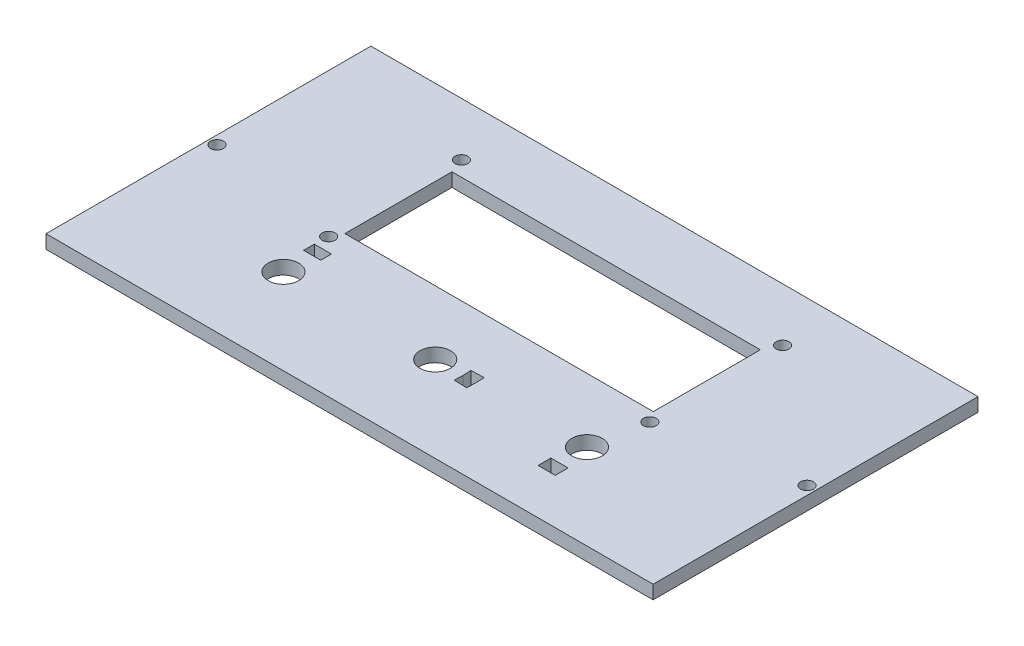
ISO-10303-21;
HEADER;
FILE_DESCRIPTION(('STEP AP214'),'2;1');
FILE_NAME('part.step','',(''),(''),'','','');
FILE_SCHEMA(('AUTOMOTIVE_DESIGN { 1 0 10303 214 1 1 1 1 }'));
ENDSEC;
DATA;
#1=APPLICATION_CONTEXT('core data for automotive mechanical design processes');
#2=APPLICATION_PROTOCOL_DEFINITION('international standard','automotive_design',2000,#1);
#3=PRODUCT_CONTEXT('',#1,'mechanical');
#4=PRODUCT('Part','Part','',(#3));
#5=PRODUCT_RELATED_PRODUCT_CATEGORY('part','',(#4));
#6=PRODUCT_DEFINITION_FORMATION('','',#4);
#7=PRODUCT_DEFINITION_CONTEXT('part definition',#1,'design');
#8=PRODUCT_DEFINITION('design','',#6,#7);
#9=PRODUCT_DEFINITION_SHAPE('','',#8);
#10=(LENGTH_UNIT() NAMED_UNIT(*) SI_UNIT(.MILLI.,.METRE.));
#11=(NAMED_UNIT(*) PLANE_ANGLE_UNIT() SI_UNIT($,.RADIAN.));
#12=(NAMED_UNIT(*) SI_UNIT($,.STERADIAN.) SOLID_ANGLE_UNIT());
#13=UNCERTAINTY_MEASURE_WITH_UNIT(LENGTH_MEASURE(1.E-05),#10,'distance_accuracy_value','');
#14=(GEOMETRIC_REPRESENTATION_CONTEXT(3) GLOBAL_UNCERTAINTY_ASSIGNED_CONTEXT((#13)) GLOBAL_UNIT_ASSIGNED_CONTEXT((#10,
#11,#12)) REPRESENTATION_CONTEXT('',''));
#15=CARTESIAN_POINT('',(0.,0.,0.));
#16=DIRECTION('',(0.,0.,1.));
#17=DIRECTION('',(1.,0.,0.));
#18=AXIS2_PLACEMENT_3D('',#15,#16,#17);
#19=CARTESIAN_POINT('',(0.,3.175,0.));
#20=DIRECTION('',(0.,1.,0.));
#21=DIRECTION('',(0.,0.,1.));
#22=AXIS2_PLACEMENT_3D('',#19,#20,#21);
#23=PLANE('',#22);
#24=CARTESIAN_POINT('',(68.8808195,3.175,0.));
#25=DIRECTION('',(0.,1.,0.));
#26=DIRECTION('',(0.,0.,1.));
#27=AXIS2_PLACEMENT_3D('',#24,#25,#26);
#28=CIRCLE('',#27,1.5);
#29=CARTESIAN_POINT('',(68.8808195,3.175,1.5));
#30=VERTEX_POINT('',#29);
#31=EDGE_CURVE('E347',#30,#30,#28,.T.);
#32=ORIENTED_EDGE('',*,*,#31,.F.);
#33=EDGE_LOOP('',(#32));
#34=FACE_BOUND('',#33,.T.);
#35=CARTESIAN_POINT('',(-68.8808195,3.175,0.));
#36=DIRECTION('',(0.,1.,0.));
#37=DIRECTION('',(0.,0.,1.));
#38=AXIS2_PLACEMENT_3D('',#35,#36,#37);
#39=CIRCLE('',#38,1.5);
#40=CARTESIAN_POINT('',(-68.8808195,3.175,1.50000000000001));
#41=VERTEX_POINT('',#40);
#42=EDGE_CURVE('E346',#41,#41,#39,.T.);
#43=ORIENTED_EDGE('',*,*,#42,.F.);
#44=EDGE_LOOP('',(#43));
#45=FACE_BOUND('',#44,.T.);
#46=CARTESIAN_POINT('',(-37.3,3.175,-25.4850000000002));
#47=DIRECTION('',(0.,1.,0.));
#48=DIRECTION('',(0.,0.,1.));
#49=AXIS2_PLACEMENT_3D('',#46,#47,#48);
#50=CIRCLE('',#49,1.5);
#51=CARTESIAN_POINT('',(-37.3,3.175,-23.9850000000002));
#52=VERTEX_POINT('',#51);
#53=EDGE_CURVE('E364',#52,#52,#50,.T.);
#54=ORIENTED_EDGE('',*,*,#53,.F.);
#55=EDGE_LOOP('',(#54));
#56=FACE_BOUND('',#55,.T.);
#57=CARTESIAN_POINT('',(-37.3,3.175,5.51499999999984));
#58=DIRECTION('',(0.,1.,0.));
#59=DIRECTION('',(0.,0.,1.));
#60=AXIS2_PLACEMENT_3D('',#57,#58,#59);
#61=CIRCLE('',#60,1.5);
#62=CARTESIAN_POINT('',(-37.3,3.175,7.01499999999985));
#63=VERTEX_POINT('',#62);
#64=EDGE_CURVE('E360',#63,#63,#61,.T.);
#65=ORIENTED_EDGE('',*,*,#64,.F.);
#66=EDGE_LOOP('',(#65));
#67=FACE_BOUND('',#66,.T.);
#68=CARTESIAN_POINT('',(37.7,3.175,5.51499999999984));
#69=DIRECTION('',(0.,1.,0.));
#70=DIRECTION('',(0.,0.,1.));
#71=AXIS2_PLACEMENT_3D('',#68,#69,#70);
#72=CIRCLE('',#71,1.5);
#73=CARTESIAN_POINT('',(37.7,3.175,7.01499999999985));
#74=VERTEX_POINT('',#73);
#75=EDGE_CURVE('E355',#74,#74,#72,.T.);
#76=ORIENTED_EDGE('',*,*,#75,.F.);
#77=EDGE_LOOP('',(#76));
#78=FACE_BOUND('',#77,.T.);
#79=CARTESIAN_POINT('',(37.7,3.175,-25.4850000000002));
#80=DIRECTION('',(0.,1.,0.));
#81=DIRECTION('',(0.,0.,1.));
#82=AXIS2_PLACEMENT_3D('',#79,#80,#81);
#83=CIRCLE('',#82,1.5);
#84=CARTESIAN_POINT('',(37.7,3.175,-23.9850000000002));
#85=VERTEX_POINT('',#84);
#86=EDGE_CURVE('E359',#85,#85,#83,.T.);
#87=ORIENTED_EDGE('',*,*,#86,.F.);
#88=EDGE_LOOP('',(#87));
#89=FACE_BOUND('',#88,.T.);
#90=DIRECTION('',(-1.,0.,0.));
#91=VECTOR('',#90,1.);
#92=CARTESIAN_POINT('',(36.,3.175,-21.985));
#93=LINE('',#92,#91);
#94=CARTESIAN_POINT('',(36.,3.175,-21.985));
#95=VERTEX_POINT('',#94);
#96=CARTESIAN_POINT('',(-36.,3.175,-21.985));
#97=VERTEX_POINT('',#96);
#98=EDGE_CURVE('E372',#95,#97,#93,.T.);
#99=ORIENTED_EDGE('',*,*,#98,.F.);
#100=DIRECTION('',(0.,0.,-1.));
#101=VECTOR('',#100,1.);
#102=CARTESIAN_POINT('',(36.,3.175,-21.985));
#103=LINE('',#102,#101);
#104=CARTESIAN_POINT('',(36.,3.175,3.01499999999998));
#105=VERTEX_POINT('',#104);
#106=EDGE_CURVE('E384',#105,#95,#103,.T.);
#107=ORIENTED_EDGE('',*,*,#106,.F.);
#108=DIRECTION('',(1.,0.,0.));
#109=VECTOR('',#108,1.);
#110=CARTESIAN_POINT('',(-36.,3.175,3.015));
#111=LINE('',#110,#109);
#112=CARTESIAN_POINT('',(-36.,3.175,3.015));
#113=VERTEX_POINT('',#112);
#114=EDGE_CURVE('E380',#113,#105,#111,.T.);
#115=ORIENTED_EDGE('',*,*,#114,.F.);
#116=DIRECTION('',(0.,0.,1.));
#117=VECTOR('',#116,1.);
#118=CARTESIAN_POINT('',(-36.,3.175,-21.985));
#119=LINE('',#118,#117);
#120=EDGE_CURVE('E375',#97,#113,#119,.T.);
#121=ORIENTED_EDGE('',*,*,#120,.F.);
#122=EDGE_LOOP('',(#99,#107,#115,#121));
#123=FACE_BOUND('',#122,.T.);
#124=CARTESIAN_POINT('',(-35.4408195,3.175,17.92920774285));
#125=DIRECTION('',(0.,1.,0.));
#126=DIRECTION('',(0.,0.,1.));
#127=AXIS2_PLACEMENT_3D('',#124,#125,#126);
#128=CIRCLE('',#127,3.5625);
#129=CARTESIAN_POINT('',(-35.4408195,3.175,21.49170774285));
#130=VERTEX_POINT('',#129);
#131=EDGE_CURVE('E402',#130,#130,#128,.T.);
#132=ORIENTED_EDGE('',*,*,#131,.F.);
#133=EDGE_LOOP('',(#132));
#134=FACE_BOUND('',#133,.T.);
#135=CARTESIAN_POINT('',(0.,3.175,17.92920774285));
#136=DIRECTION('',(0.,1.,0.));
#137=DIRECTION('',(0.,0.,1.));
#138=AXIS2_PLACEMENT_3D('',#135,#136,#137);
#139=CIRCLE('',#138,3.5625);
#140=CARTESIAN_POINT('',(0.,3.175,21.49170774285));
#141=VERTEX_POINT('',#140);
#142=EDGE_CURVE('E407',#141,#141,#139,.T.);
#143=ORIENTED_EDGE('',*,*,#142,.F.);
#144=EDGE_LOOP('',(#143));
#145=FACE_BOUND('',#144,.T.);
#146=CARTESIAN_POINT('',(35.4408195,3.175,17.92920774285));
#147=DIRECTION('',(0.,1.,0.));
#148=DIRECTION('',(0.,0.,1.));
#149=AXIS2_PLACEMENT_3D('',#146,#147,#148);
#150=CIRCLE('',#149,3.5625);
#151=CARTESIAN_POINT('',(35.4408195,3.175,21.49170774285));
#152=VERTEX_POINT('',#151);
#153=EDGE_CURVE('E392',#152,#152,#150,.T.);
#154=ORIENTED_EDGE('',*,*,#153,.F.);
#155=EDGE_LOOP('',(#154));
#156=FACE_BOUND('',#155,.T.);
#157=DIRECTION('',(0.,0.,-1.));
#158=VECTOR('',#157,1.);
#159=CARTESIAN_POINT('',(70.8808195,3.175,-37.92920774285));
#160=LINE('',#159,#158);
#161=CARTESIAN_POINT('',(70.8808195,3.175,37.92920774285));
#162=VERTEX_POINT('',#161);
#163=CARTESIAN_POINT('',(70.8808195,3.175,-37.92920774285));
#164=VERTEX_POINT('',#163);
#165=EDGE_CURVE('E414',#162,#164,#160,.T.);
#166=ORIENTED_EDGE('',*,*,#165,.T.);
#167=DIRECTION('',(-1.,0.,0.));
#168=VECTOR('',#167,1.);
#169=CARTESIAN_POINT('',(-70.8808195,3.175,-37.92920774285));
#170=LINE('',#169,#168);
#171=CARTESIAN_POINT('',(-70.8808195,3.175,-37.92920774285));
#172=VERTEX_POINT('',#171);
#173=EDGE_CURVE('E418',#164,#172,#170,.T.);
#174=ORIENTED_EDGE('',*,*,#173,.T.);
#175=DIRECTION('',(0.,0.,1.));
#176=VECTOR('',#175,1.);
#177=CARTESIAN_POINT('',(-70.8808195,3.175,-37.92920774285));
#178=LINE('',#177,#176);
#179=CARTESIAN_POINT('',(-70.8808195,3.175,37.92920774285));
#180=VERTEX_POINT('',#179);
#181=EDGE_CURVE('E422',#172,#180,#178,.T.);
#182=ORIENTED_EDGE('',*,*,#181,.T.);
#183=DIRECTION('',(1.,0.,0.));
#184=VECTOR('',#183,1.);
#185=CARTESIAN_POINT('',(-70.8808195,3.175,37.92920774285));
#186=LINE('',#185,#184);
#187=EDGE_CURVE('E425',#180,#162,#186,.T.);
#188=ORIENTED_EDGE('',*,*,#187,.T.);
#189=EDGE_LOOP('',(#166,#174,#182,#188));
#190=FACE_BOUND('',#189,.T.);
#191=DIRECTION('',(0.,0.,1.));
#192=VECTOR('',#191,1.);
#193=CARTESIAN_POINT('',(-33.4408195,3.175,0.));
#194=LINE('',#193,#192);
#195=CARTESIAN_POINT('',(-33.4408195,3.175,8.72541481264997));
#196=VERTEX_POINT('',#195);
#197=CARTESIAN_POINT('',(-33.4408195,3.175,11.22541481265));
#198=VERTEX_POINT('',#197);
#199=EDGE_CURVE('E304',#196,#198,#194,.T.);
#200=ORIENTED_EDGE('',*,*,#199,.T.);
#201=DIRECTION('',(-1.,0.,0.));
#202=VECTOR('',#201,1.);
#203=CARTESIAN_POINT('',(0.,3.175,11.22541481265));
#204=LINE('',#203,#202);
#205=CARTESIAN_POINT('',(-37.4408195,3.175,11.22541481265));
#206=VERTEX_POINT('',#205);
#207=EDGE_CURVE('E308',#198,#206,#204,.T.);
#208=ORIENTED_EDGE('',*,*,#207,.T.);
#209=DIRECTION('',(0.,0.,1.));
#210=VECTOR('',#209,1.);
#211=CARTESIAN_POINT('',(-37.4408195,3.175,0.));
#212=LINE('',#211,#210);
#213=CARTESIAN_POINT('',(-37.4408195,3.175,8.72541481264997));
#214=VERTEX_POINT('',#213);
#215=EDGE_CURVE('E223',#214,#206,#212,.T.);
#216=ORIENTED_EDGE('',*,*,#215,.F.);
#217=DIRECTION('',(1.,0.,0.));
#218=VECTOR('',#217,1.);
#219=CARTESIAN_POINT('',(0.,3.175,8.72541481264997));
#220=LINE('',#219,#218);
#221=EDGE_CURVE('E300',#214,#196,#220,.T.);
#222=ORIENTED_EDGE('',*,*,#221,.T.);
#223=EDGE_LOOP('',(#200,#208,#216,#222));
#224=FACE_BOUND('',#223,.T.);
#225=DIRECTION('',(-0.0266639306913008,0.,0.999644454193635));
#226=VECTOR('',#225,1.);
#227=CARTESIAN_POINT('',(6.92656455818514,3.175,0.1847551262186));
#228=LINE('',#227,#226);
#229=CARTESIAN_POINT('',(6.45325942180383,3.175,17.9292077428501));
#230=VERTEX_POINT('',#229);
#231=CARTESIAN_POINT('',(6.4009794202858,3.175,19.8892118468131));
#232=VERTEX_POINT('',#231);
#233=EDGE_CURVE('E326',#230,#232,#228,.T.);
#234=ORIENTED_EDGE('',*,*,#233,.F.);
#235=DIRECTION('',(-0.0266639306913067,0.,-0.999644454193634));
#236=VECTOR('',#235,1.);
#237=CARTESIAN_POINT('',(5.97077819967263,3.175,-0.159261040684369));
#238=LINE('',#237,#236);
#239=CARTESIAN_POINT('',(6.40097942028579,3.175,15.969203638887));
#240=VERTEX_POINT('',#239);
#241=EDGE_CURVE('E329',#230,#240,#238,.T.);
#242=ORIENTED_EDGE('',*,*,#241,.T.);
#243=DIRECTION('',(-0.999644454193634,0.,0.0266639306913096));
#244=VECTOR('',#243,1.);
#245=CARTESIAN_POINT('',(0.430201220613209,3.175,16.1284646795714));
#246=LINE('',#245,#244);
#247=CARTESIAN_POINT('',(9.39991278286669,3.175,15.8892118468131));
#248=VERTEX_POINT('',#247);
#249=EDGE_CURVE('E312',#248,#240,#246,.T.);
#250=ORIENTED_EDGE('',*,*,#249,.F.);
#251=DIRECTION('',(-0.0266639306913091,0.,-0.999644454193634));
#252=VECTOR('',#251,1.);
#253=CARTESIAN_POINT('',(8.96971156225349,3.175,-0.239252832758309));
#254=LINE('',#253,#252);
#255=CARTESIAN_POINT('',(9.45432643859628,3.175,17.92920774285));
#256=VERTEX_POINT('',#255);
#257=EDGE_CURVE('E315',#256,#248,#254,.T.);
#258=ORIENTED_EDGE('',*,*,#257,.F.);
#259=DIRECTION('',(-0.0266639306913024,0.,0.999644454193635));
#260=VECTOR('',#259,1.);
#261=CARTESIAN_POINT('',(9.92549792076607,3.175,0.26474691829252));
#262=LINE('',#261,#260);
#263=CARTESIAN_POINT('',(9.3999127828667,3.175,19.969203638887));
#264=VERTEX_POINT('',#263);
#265=EDGE_CURVE('E318',#256,#264,#262,.T.);
#266=ORIENTED_EDGE('',*,*,#265,.T.);
#267=DIRECTION('',(-0.999644454193635,0.,-0.0266639306913027));
#268=VECTOR('',#267,1.);
#269=CARTESIAN_POINT('',(-0.525585137899372,3.175,19.7044567205945));
#270=LINE('',#269,#268);
#271=EDGE_CURVE('E322',#264,#232,#270,.T.);
#272=ORIENTED_EDGE('',*,*,#271,.T.);
#273=EDGE_LOOP('',(#234,#242,#250,#258,#266,#272));
#274=FACE_BOUND('',#273,.T.);
#275=DIRECTION('',(1.,0.,0.));
#276=VECTOR('',#275,1.);
#277=CARTESIAN_POINT('',(0.,3.175,24.3496589051601));
#278=LINE('',#277,#276);
#279=CARTESIAN_POINT('',(33.4408195,3.175,24.3496589051601));
#280=VERTEX_POINT('',#279);
#281=CARTESIAN_POINT('',(37.4408195,3.175,24.3496589051601));
#282=VERTEX_POINT('',#281);
#283=EDGE_CURVE('E338',#280,#282,#278,.T.);
#284=ORIENTED_EDGE('',*,*,#283,.T.);
#285=DIRECTION('',(0.,0.,1.));
#286=VECTOR('',#285,1.);
#287=CARTESIAN_POINT('',(37.4408194999999,3.175,0.));
#288=LINE('',#287,#286);
#289=CARTESIAN_POINT('',(37.4408195,3.175,27.3496589051602));
#290=VERTEX_POINT('',#289);
#291=EDGE_CURVE('E342',#282,#290,#288,.T.);
#292=ORIENTED_EDGE('',*,*,#291,.T.);
#293=DIRECTION('',(1.,0.,0.));
#294=VECTOR('',#293,1.);
#295=CARTESIAN_POINT('',(0.,3.175,27.3496589051602));
#296=LINE('',#295,#294);
#297=CARTESIAN_POINT('',(33.4408195,3.175,27.3496589051602));
#298=VERTEX_POINT('',#297);
#299=EDGE_CURVE('E333',#298,#290,#296,.T.);
#300=ORIENTED_EDGE('',*,*,#299,.F.);
#301=DIRECTION('',(0.,0.,1.));
#302=VECTOR('',#301,1.);
#303=CARTESIAN_POINT('',(33.4408195000001,3.175,0.));
#304=LINE('',#303,#302);
#305=EDGE_CURVE('E195',#280,#298,#304,.T.);
#306=ORIENTED_EDGE('',*,*,#305,.F.);
#307=EDGE_LOOP('',(#284,#292,#300,#306));
#308=FACE_BOUND('',#307,.T.);
#309=ADVANCED_FACE('F38',(#34,#45,#56,#67,#78,#89,#123,#134,#145,#156,#190,#224,#274,#308),#23,.T.);
#310=CARTESIAN_POINT('',(0.,0.,0.));
#311=DIRECTION('',(0.,1.,0.));
#312=DIRECTION('',(0.,0.,1.));
#313=AXIS2_PLACEMENT_3D('',#310,#311,#312);
#314=PLANE('',#313);
#315=DIRECTION('',(0.0266639306913067,0.,0.999644454193635));
#316=VECTOR('',#315,1.);
#317=CARTESIAN_POINT('',(5.97077819967263,0.,-0.159261040684369));
#318=LINE('',#317,#316);
#319=CARTESIAN_POINT('',(6.40097942028579,0.,15.969203638887));
#320=VERTEX_POINT('',#319);
#321=CARTESIAN_POINT('',(6.45325942180383,0.,17.9292077428501));
#322=VERTEX_POINT('',#321);
#323=EDGE_CURVE('E228',#320,#322,#318,.T.);
#324=ORIENTED_EDGE('',*,*,#323,.T.);
#325=DIRECTION('',(0.0266639306913008,0.,-0.999644454193635));
#326=VECTOR('',#325,1.);
#327=CARTESIAN_POINT('',(6.92656455818513,0.,0.1847551262186));
#328=LINE('',#327,#326);
#329=CARTESIAN_POINT('',(6.4009794202858,0.,19.8892118468131));
#330=VERTEX_POINT('',#329);
#331=EDGE_CURVE('E248',#330,#322,#328,.T.);
#332=ORIENTED_EDGE('',*,*,#331,.F.);
#333=DIRECTION('',(0.999644454193635,0.,0.0266639306913027));
#334=VECTOR('',#333,1.);
#335=CARTESIAN_POINT('',(-0.525585137899372,0.,19.7044567205945));
#336=LINE('',#335,#334);
#337=CARTESIAN_POINT('',(9.3999127828667,0.,19.969203638887));
#338=VERTEX_POINT('',#337);
#339=EDGE_CURVE('E244',#330,#338,#336,.T.);
#340=ORIENTED_EDGE('',*,*,#339,.T.);
#341=DIRECTION('',(0.0266639306913024,0.,-0.999644454193635));
#342=VECTOR('',#341,1.);
#343=CARTESIAN_POINT('',(9.92549792076607,0.,0.26474691829252));
#344=LINE('',#343,#342);
#345=CARTESIAN_POINT('',(9.45432643859628,0.,17.92920774285));
#346=VERTEX_POINT('',#345);
#347=EDGE_CURVE('E240',#338,#346,#344,.T.);
#348=ORIENTED_EDGE('',*,*,#347,.T.);
#349=DIRECTION('',(0.0266639306913091,0.,0.999644454193634));
#350=VECTOR('',#349,1.);
#351=CARTESIAN_POINT('',(8.96971156225349,0.,-0.239252832758309));
#352=LINE('',#351,#350);
#353=CARTESIAN_POINT('',(9.39991278286669,0.,15.8892118468131));
#354=VERTEX_POINT('',#353);
#355=EDGE_CURVE('E236',#354,#346,#352,.T.);
#356=ORIENTED_EDGE('',*,*,#355,.F.);
#357=DIRECTION('',(0.999644454193634,0.,-0.0266639306913096));
#358=VECTOR('',#357,1.);
#359=CARTESIAN_POINT('',(0.430201220613209,0.,16.1284646795714));
#360=LINE('',#359,#358);
#361=EDGE_CURVE('E232',#320,#354,#360,.T.);
#362=ORIENTED_EDGE('',*,*,#361,.F.);
#363=EDGE_LOOP('',(#324,#332,#340,#348,#356,#362));
#364=FACE_BOUND('',#363,.T.);
#365=DIRECTION('',(0.,0.,-1.));
#366=VECTOR('',#365,1.);
#367=CARTESIAN_POINT('',(70.8808195,0.,-37.92920774285));
#368=LINE('',#367,#366);
#369=CARTESIAN_POINT('',(70.8808195,0.,37.92920774285));
#370=VERTEX_POINT('',#369);
#371=CARTESIAN_POINT('',(70.8808195,0.,-37.92920774285));
#372=VERTEX_POINT('',#371);
#373=EDGE_CURVE('E429',#370,#372,#368,.T.);
#374=ORIENTED_EDGE('',*,*,#373,.F.);
#375=DIRECTION('',(1.,0.,0.));
#376=VECTOR('',#375,1.);
#377=CARTESIAN_POINT('',(-70.8808195,0.,37.92920774285));
#378=LINE('',#377,#376);
#379=CARTESIAN_POINT('',(-70.8808195,0.,37.92920774285));
#380=VERTEX_POINT('',#379);
#381=EDGE_CURVE('E419',#380,#370,#378,.T.);
#382=ORIENTED_EDGE('',*,*,#381,.F.);
#383=DIRECTION('',(0.,0.,1.));
#384=VECTOR('',#383,1.);
#385=CARTESIAN_POINT('',(-70.8808195,0.,-37.92920774285));
#386=LINE('',#385,#384);
#387=CARTESIAN_POINT('',(-70.8808195,0.,-37.92920774285));
#388=VERTEX_POINT('',#387);
#389=EDGE_CURVE('E437',#388,#380,#386,.T.);
#390=ORIENTED_EDGE('',*,*,#389,.F.);
#391=DIRECTION('',(-1.,0.,0.));
#392=VECTOR('',#391,1.);
#393=CARTESIAN_POINT('',(-70.8808195,0.,-37.92920774285));
#394=LINE('',#393,#392);
#395=EDGE_CURVE('E433',#372,#388,#394,.T.);
#396=ORIENTED_EDGE('',*,*,#395,.F.);
#397=EDGE_LOOP('',(#374,#382,#390,#396));
#398=FACE_BOUND('',#397,.T.);
#399=CARTESIAN_POINT('',(35.4408195,0.,17.92920774285));
#400=DIRECTION('',(0.,1.,0.));
#401=DIRECTION('',(0.,0.,1.));
#402=AXIS2_PLACEMENT_3D('',#399,#400,#401);
#403=CIRCLE('',#402,3.5625);
#404=CARTESIAN_POINT('',(35.4408195,0.,21.49170774285));
#405=VERTEX_POINT('',#404);
#406=EDGE_CURVE('E406',#405,#405,#403,.T.);
#407=ORIENTED_EDGE('',*,*,#406,.T.);
#408=EDGE_LOOP('',(#407));
#409=FACE_BOUND('',#408,.T.);
#410=CARTESIAN_POINT('',(0.,0.,17.92920774285));
#411=DIRECTION('',(0.,1.,0.));
#412=DIRECTION('',(0.,0.,1.));
#413=AXIS2_PLACEMENT_3D('',#410,#411,#412);
#414=CIRCLE('',#413,3.5625);
#415=CARTESIAN_POINT('',(0.,0.,21.49170774285));
#416=VERTEX_POINT('',#415);
#417=EDGE_CURVE('E461',#416,#416,#414,.T.);
#418=ORIENTED_EDGE('',*,*,#417,.T.);
#419=EDGE_LOOP('',(#418));
#420=FACE_BOUND('',#419,.T.);
#421=CARTESIAN_POINT('',(-35.4408195,0.,17.92920774285));
#422=DIRECTION('',(0.,1.,0.));
#423=DIRECTION('',(0.,0.,1.));
#424=AXIS2_PLACEMENT_3D('',#421,#422,#423);
#425=CIRCLE('',#424,3.5625);
#426=CARTESIAN_POINT('',(-35.4408195,0.,21.49170774285));
#427=VERTEX_POINT('',#426);
#428=EDGE_CURVE('E434',#427,#427,#425,.T.);
#429=ORIENTED_EDGE('',*,*,#428,.T.);
#430=EDGE_LOOP('',(#429));
#431=FACE_BOUND('',#430,.T.);
#432=DIRECTION('',(0.,0.,-1.));
#433=VECTOR('',#432,1.);
#434=CARTESIAN_POINT('',(36.,0.,0.));
#435=LINE('',#434,#433);
#436=CARTESIAN_POINT('',(36.,0.,3.01499999999998));
#437=VERTEX_POINT('',#436);
#438=CARTESIAN_POINT('',(36.,0.,-21.985));
#439=VERTEX_POINT('',#438);
#440=EDGE_CURVE('E48',#437,#439,#435,.T.);
#441=ORIENTED_EDGE('',*,*,#440,.T.);
#442=DIRECTION('',(-1.,0.,0.));
#443=VECTOR('',#442,1.);
#444=CARTESIAN_POINT('',(0.,0.,-21.985));
#445=LINE('',#444,#443);
#446=CARTESIAN_POINT('',(-36.,0.,-21.985));
#447=VERTEX_POINT('',#446);
#448=EDGE_CURVE('E11',#439,#447,#445,.T.);
#449=ORIENTED_EDGE('',*,*,#448,.T.);
#450=DIRECTION('',(0.,0.,1.));
#451=VECTOR('',#450,1.);
#452=CARTESIAN_POINT('',(-36.,0.,0.));
#453=LINE('',#452,#451);
#454=CARTESIAN_POINT('',(-36.,0.,3.015));
#455=VERTEX_POINT('',#454);
#456=EDGE_CURVE('E457',#447,#455,#453,.T.);
#457=ORIENTED_EDGE('',*,*,#456,.T.);
#458=DIRECTION('',(1.,0.,0.));
#459=VECTOR('',#458,1.);
#460=CARTESIAN_POINT('',(0.,0.,3.01499999999999));
#461=LINE('',#460,#459);
#462=EDGE_CURVE('E471',#455,#437,#461,.T.);
#463=ORIENTED_EDGE('',*,*,#462,.T.);
#464=EDGE_LOOP('',(#441,#449,#457,#463));
#465=FACE_BOUND('',#464,.T.);
#466=CARTESIAN_POINT('',(37.7,0.,-25.4850000000002));
#467=DIRECTION('',(0.,1.,0.));
#468=DIRECTION('',(0.,0.,1.));
#469=AXIS2_PLACEMENT_3D('',#466,#467,#468);
#470=CIRCLE('',#469,1.5);
#471=CARTESIAN_POINT('',(37.7,0.,-23.9850000000002));
#472=VERTEX_POINT('',#471);
#473=EDGE_CURVE('E371',#472,#472,#470,.T.);
#474=ORIENTED_EDGE('',*,*,#473,.T.);
#475=EDGE_LOOP('',(#474));
#476=FACE_BOUND('',#475,.T.);
#477=CARTESIAN_POINT('',(37.7,0.,5.51499999999984));
#478=DIRECTION('',(0.,1.,0.));
#479=DIRECTION('',(0.,0.,1.));
#480=AXIS2_PLACEMENT_3D('',#477,#478,#479);
#481=CIRCLE('',#480,1.5);
#482=CARTESIAN_POINT('',(37.7,0.,7.01499999999985));
#483=VERTEX_POINT('',#482);
#484=EDGE_CURVE('E481',#483,#483,#481,.T.);
#485=ORIENTED_EDGE('',*,*,#484,.T.);
#486=EDGE_LOOP('',(#485));
#487=FACE_BOUND('',#486,.T.);
#488=CARTESIAN_POINT('',(-37.3,0.,5.51499999999984));
#489=DIRECTION('',(0.,1.,0.));
#490=DIRECTION('',(0.,0.,1.));
#491=AXIS2_PLACEMENT_3D('',#488,#489,#490);
#492=CIRCLE('',#491,1.5);
#493=CARTESIAN_POINT('',(-37.3,0.,7.01499999999985));
#494=VERTEX_POINT('',#493);
#495=EDGE_CURVE('E485',#494,#494,#492,.T.);
#496=ORIENTED_EDGE('',*,*,#495,.T.);
#497=EDGE_LOOP('',(#496));
#498=FACE_BOUND('',#497,.T.);
#499=CARTESIAN_POINT('',(-37.3,0.,-25.4850000000002));
#500=DIRECTION('',(0.,1.,0.));
#501=DIRECTION('',(0.,0.,1.));
#502=AXIS2_PLACEMENT_3D('',#499,#500,#501);
#503=CIRCLE('',#502,1.5);
#504=CARTESIAN_POINT('',(-37.3,0.,-23.9850000000002));
#505=VERTEX_POINT('',#504);
#506=EDGE_CURVE('E376',#505,#505,#503,.T.);
#507=ORIENTED_EDGE('',*,*,#506,.T.);
#508=EDGE_LOOP('',(#507));
#509=FACE_BOUND('',#508,.T.);
#510=CARTESIAN_POINT('',(-68.8808195,0.,0.));
#511=DIRECTION('',(0.,1.,0.));
#512=DIRECTION('',(0.,0.,1.));
#513=AXIS2_PLACEMENT_3D('',#510,#511,#512);
#514=CIRCLE('',#513,1.5);
#515=CARTESIAN_POINT('',(-68.8808195,0.,1.50000000000001));
#516=VERTEX_POINT('',#515);
#517=EDGE_CURVE('E351',#516,#516,#514,.T.);
#518=ORIENTED_EDGE('',*,*,#517,.T.);
#519=EDGE_LOOP('',(#518));
#520=FACE_BOUND('',#519,.T.);
#521=CARTESIAN_POINT('',(68.8808195,0.,0.));
#522=DIRECTION('',(0.,1.,0.));
#523=DIRECTION('',(0.,0.,1.));
#524=AXIS2_PLACEMENT_3D('',#521,#522,#523);
#525=CIRCLE('',#524,1.5);
#526=CARTESIAN_POINT('',(68.8808195,0.,1.5));
#527=VERTEX_POINT('',#526);
#528=EDGE_CURVE('E42',#527,#527,#525,.T.);
#529=ORIENTED_EDGE('',*,*,#528,.T.);
#530=EDGE_LOOP('',(#529));
#531=FACE_BOUND('',#530,.T.);
#532=DIRECTION('',(1.,0.,0.));
#533=VECTOR('',#532,1.);
#534=CARTESIAN_POINT('',(0.,0.,11.22541481265));
#535=LINE('',#534,#533);
#536=CARTESIAN_POINT('',(-37.4408195,0.,11.22541481265));
#537=VERTEX_POINT('',#536);
#538=CARTESIAN_POINT('',(-33.4408195,0.,11.22541481265));
#539=VERTEX_POINT('',#538);
#540=EDGE_CURVE('E270',#537,#539,#535,.T.);
#541=ORIENTED_EDGE('',*,*,#540,.T.);
#542=DIRECTION('',(0.,0.,-1.));
#543=VECTOR('',#542,1.);
#544=CARTESIAN_POINT('',(-33.4408195,0.,0.));
#545=LINE('',#544,#543);
#546=CARTESIAN_POINT('',(-33.4408195,0.,8.72541481264997));
#547=VERTEX_POINT('',#546);
#548=EDGE_CURVE('E282',#539,#547,#545,.T.);
#549=ORIENTED_EDGE('',*,*,#548,.T.);
#550=DIRECTION('',(-1.,0.,0.));
#551=VECTOR('',#550,1.);
#552=CARTESIAN_POINT('',(0.,0.,8.72541481264997));
#553=LINE('',#552,#551);
#554=CARTESIAN_POINT('',(-37.4408195,0.,8.72541481264997));
#555=VERTEX_POINT('',#554);
#556=EDGE_CURVE('E278',#547,#555,#553,.T.);
#557=ORIENTED_EDGE('',*,*,#556,.T.);
#558=DIRECTION('',(0.,0.,-1.));
#559=VECTOR('',#558,1.);
#560=CARTESIAN_POINT('',(-37.4408195,0.,0.));
#561=LINE('',#560,#559);
#562=EDGE_CURVE('E274',#537,#555,#561,.T.);
#563=ORIENTED_EDGE('',*,*,#562,.F.);
#564=EDGE_LOOP('',(#541,#549,#557,#563));
#565=FACE_BOUND('',#564,.T.);
#566=DIRECTION('',(0.,0.,-1.));
#567=VECTOR('',#566,1.);
#568=CARTESIAN_POINT('',(37.4408194999999,0.,0.));
#569=LINE('',#568,#567);
#570=CARTESIAN_POINT('',(37.4408195,0.,27.3496589051602));
#571=VERTEX_POINT('',#570);
#572=CARTESIAN_POINT('',(37.4408195,0.,24.3496589051601));
#573=VERTEX_POINT('',#572);
#574=EDGE_CURVE('E209',#571,#573,#569,.T.);
#575=ORIENTED_EDGE('',*,*,#574,.T.);
#576=DIRECTION('',(-1.,0.,0.));
#577=VECTOR('',#576,1.);
#578=CARTESIAN_POINT('',(0.,0.,24.3496589051601));
#579=LINE('',#578,#577);
#580=CARTESIAN_POINT('',(33.4408195,0.,24.3496589051601));
#581=VERTEX_POINT('',#580);
#582=EDGE_CURVE('E213',#573,#581,#579,.T.);
#583=ORIENTED_EDGE('',*,*,#582,.T.);
#584=DIRECTION('',(0.,0.,-1.));
#585=VECTOR('',#584,1.);
#586=CARTESIAN_POINT('',(33.4408195000001,0.,0.));
#587=LINE('',#586,#585);
#588=CARTESIAN_POINT('',(33.4408195,0.,27.3496589051602));
#589=VERTEX_POINT('',#588);
#590=EDGE_CURVE('E192',#589,#581,#587,.T.);
#591=ORIENTED_EDGE('',*,*,#590,.F.);
#592=DIRECTION('',(-1.,0.,0.));
#593=VECTOR('',#592,1.);
#594=CARTESIAN_POINT('',(0.,0.,27.3496589051602));
#595=LINE('',#594,#593);
#596=EDGE_CURVE('E203',#571,#589,#595,.T.);
#597=ORIENTED_EDGE('',*,*,#596,.F.);
#598=EDGE_LOOP('',(#575,#583,#591,#597));
#599=FACE_BOUND('',#598,.T.);
#600=ADVANCED_FACE('F211',(#364,#398,#409,#420,#431,#465,#476,#487,#498,#509,#520,#531,#565,
#599),#314,.F.);
#601=CARTESIAN_POINT('',(70.8808195,3.175,-37.92920774285));
#602=DIRECTION('',(-1.,0.,0.));
#603=DIRECTION('',(0.,0.,1.));
#604=AXIS2_PLACEMENT_3D('',#601,#602,#603);
#605=PLANE('',#604);
#606=ORIENTED_EDGE('',*,*,#373,.T.);
#607=DIRECTION('',(0.,-1.,0.));
#608=VECTOR('',#607,1.);
#609=CARTESIAN_POINT('',(70.8808195,3.175,-37.92920774285));
#610=LINE('',#609,#608);
#611=EDGE_CURVE('E453',#164,#372,#610,.T.);
#612=ORIENTED_EDGE('',*,*,#611,.F.);
#613=ORIENTED_EDGE('',*,*,#165,.F.);
#614=DIRECTION('',(0.,-1.,0.));
#615=VECTOR('',#614,1.);
#616=CARTESIAN_POINT('',(70.8808195,3.175,37.92920774285));
#617=LINE('',#616,#615);
#618=EDGE_CURVE('E428',#162,#370,#617,.T.);
#619=ORIENTED_EDGE('',*,*,#618,.T.);
#620=EDGE_LOOP('',(#606,#612,#613,#619));
#621=FACE_BOUND('',#620,.T.);
#622=ADVANCED_FACE('F40',(#621),#605,.F.);
#623=CARTESIAN_POINT('',(-70.8808195,3.175,-37.92920774285));
#624=DIRECTION('',(0.,0.,1.));
#625=DIRECTION('',(1.,0.,0.));
#626=AXIS2_PLACEMENT_3D('',#623,#624,#625);
#627=PLANE('',#626);
#628=ORIENTED_EDGE('',*,*,#395,.T.);
#629=DIRECTION('',(0.,-1.,0.));
#630=VECTOR('',#629,1.);
#631=CARTESIAN_POINT('',(-70.8808195,3.175,-37.92920774285));
#632=LINE('',#631,#630);
#633=EDGE_CURVE('E449',#172,#388,#632,.T.);
#634=ORIENTED_EDGE('',*,*,#633,.F.);
#635=ORIENTED_EDGE('',*,*,#173,.F.);
#636=ORIENTED_EDGE('',*,*,#611,.T.);
#637=EDGE_LOOP('',(#628,#634,#635,#636));
#638=FACE_BOUND('',#637,.T.);
#639=ADVANCED_FACE('F538',(#638),#627,.F.);
#640=CARTESIAN_POINT('',(-70.8808195,3.175,-37.92920774285));
#641=DIRECTION('',(1.,0.,0.));
#642=DIRECTION('',(0.,0.,-1.));
#643=AXIS2_PLACEMENT_3D('',#640,#641,#642);
#644=PLANE('',#643);
#645=ORIENTED_EDGE('',*,*,#389,.T.);
#646=DIRECTION('',(0.,-1.,0.));
#647=VECTOR('',#646,1.);
#648=CARTESIAN_POINT('',(-70.8808195,3.175,37.92920774285));
#649=LINE('',#648,#647);
#650=EDGE_CURVE('E445',#180,#380,#649,.T.);
#651=ORIENTED_EDGE('',*,*,#650,.F.);
#652=ORIENTED_EDGE('',*,*,#181,.F.);
#653=ORIENTED_EDGE('',*,*,#633,.T.);
#654=EDGE_LOOP('',(#645,#651,#652,#653));
#655=FACE_BOUND('',#654,.T.);
#656=ADVANCED_FACE('F535',(#655),#644,.F.);
#657=CARTESIAN_POINT('',(-70.8808195,3.175,37.92920774285));
#658=DIRECTION('',(0.,0.,-1.));
#659=DIRECTION('',(-1.,0.,0.));
#660=AXIS2_PLACEMENT_3D('',#657,#658,#659);
#661=PLANE('',#660);
#662=ORIENTED_EDGE('',*,*,#381,.T.);
#663=ORIENTED_EDGE('',*,*,#618,.F.);
#664=ORIENTED_EDGE('',*,*,#187,.F.);
#665=ORIENTED_EDGE('',*,*,#650,.T.);
#666=EDGE_LOOP('',(#662,#663,#664,#665));
#667=FACE_BOUND('',#666,.T.);
#668=ADVANCED_FACE('F532',(#667),#661,.F.);
#669=CARTESIAN_POINT('',(35.4408195,-6.825,17.92920774285));
#670=DIRECTION('',(0.,1.,0.));
#671=DIRECTION('',(0.,0.,1.));
#672=AXIS2_PLACEMENT_3D('',#669,#670,#671);
#673=CYLINDRICAL_SURFACE('',#672,3.5625);
#674=ORIENTED_EDGE('',*,*,#153,.T.);
#675=EDGE_LOOP('',(#674));
#676=FACE_BOUND('',#675,.T.);
#677=ORIENTED_EDGE('',*,*,#406,.F.);
#678=EDGE_LOOP('',(#677));
#679=FACE_BOUND('',#678,.T.);
#680=ADVANCED_FACE('F529',(#676,#679),#673,.F.);
#681=CARTESIAN_POINT('',(0.,-6.825,17.92920774285));
#682=DIRECTION('',(0.,1.,0.));
#683=DIRECTION('',(0.,0.,1.));
#684=AXIS2_PLACEMENT_3D('',#681,#682,#683);
#685=CYLINDRICAL_SURFACE('',#684,3.5625);
#686=ORIENTED_EDGE('',*,*,#142,.T.);
#687=EDGE_LOOP('',(#686));
#688=FACE_BOUND('',#687,.T.);
#689=ORIENTED_EDGE('',*,*,#417,.F.);
#690=EDGE_LOOP('',(#689));
#691=FACE_BOUND('',#690,.T.);
#692=ADVANCED_FACE('F805',(#688,#691),#685,.F.);
#693=CARTESIAN_POINT('',(-35.4408195,-6.825,17.92920774285));
#694=DIRECTION('',(0.,1.,0.));
#695=DIRECTION('',(0.,0.,1.));
#696=AXIS2_PLACEMENT_3D('',#693,#694,#695);
#697=CYLINDRICAL_SURFACE('',#696,3.5625);
#698=ORIENTED_EDGE('',*,*,#131,.T.);
#699=EDGE_LOOP('',(#698));
#700=FACE_BOUND('',#699,.T.);
#701=ORIENTED_EDGE('',*,*,#428,.F.);
#702=EDGE_LOOP('',(#701));
#703=FACE_BOUND('',#702,.T.);
#704=ADVANCED_FACE('F796',(#700,#703),#697,.F.);
#705=CARTESIAN_POINT('',(36.,-6.825,-21.985));
#706=DIRECTION('',(0.,0.,-1.));
#707=DIRECTION('',(-1.,0.,0.));
#708=AXIS2_PLACEMENT_3D('',#705,#706,#707);
#709=PLANE('',#708);
#710=DIRECTION('',(0.,1.,0.));
#711=VECTOR('',#710,1.);
#712=CARTESIAN_POINT('',(36.,-6.825,-21.985));
#713=LINE('',#712,#711);
#714=EDGE_CURVE('E389',#439,#95,#713,.T.);
#715=ORIENTED_EDGE('',*,*,#714,.T.);
#716=ORIENTED_EDGE('',*,*,#98,.T.);
#717=DIRECTION('',(0.,1.,0.));
#718=VECTOR('',#717,1.);
#719=CARTESIAN_POINT('',(-36.,-6.825,-21.985));
#720=LINE('',#719,#718);
#721=EDGE_CURVE('E388',#447,#97,#720,.T.);
#722=ORIENTED_EDGE('',*,*,#721,.F.);
#723=ORIENTED_EDGE('',*,*,#448,.F.);
#724=EDGE_LOOP('',(#715,#716,#722,#723));
#725=FACE_BOUND('',#724,.T.);
#726=ADVANCED_FACE('F787',(#725),#709,.F.);
#727=CARTESIAN_POINT('',(36.,-6.825,-21.985));
#728=DIRECTION('',(1.,0.,0.));
#729=DIRECTION('',(0.,0.,-1.));
#730=AXIS2_PLACEMENT_3D('',#727,#728,#729);
#731=PLANE('',#730);
#732=DIRECTION('',(0.,1.,0.));
#733=VECTOR('',#732,1.);
#734=CARTESIAN_POINT('',(36.,-6.825,3.01499999999998));
#735=LINE('',#734,#733);
#736=EDGE_CURVE('E393',#437,#105,#735,.T.);
#737=ORIENTED_EDGE('',*,*,#736,.T.);
#738=ORIENTED_EDGE('',*,*,#106,.T.);
#739=ORIENTED_EDGE('',*,*,#714,.F.);
#740=ORIENTED_EDGE('',*,*,#440,.F.);
#741=EDGE_LOOP('',(#737,#738,#739,#740));
#742=FACE_BOUND('',#741,.T.);
#743=ADVANCED_FACE('F778',(#742),#731,.F.);
#744=CARTESIAN_POINT('',(-36.,-6.825,3.015));
#745=DIRECTION('',(0.,0.,1.));
#746=DIRECTION('',(1.,0.,0.));
#747=AXIS2_PLACEMENT_3D('',#744,#745,#746);
#748=PLANE('',#747);
#749=DIRECTION('',(0.,1.,0.));
#750=VECTOR('',#749,1.);
#751=CARTESIAN_POINT('',(-36.,-6.825,3.015));
#752=LINE('',#751,#750);
#753=EDGE_CURVE('E396',#455,#113,#752,.T.);
#754=ORIENTED_EDGE('',*,*,#753,.T.);
#755=ORIENTED_EDGE('',*,*,#114,.T.);
#756=ORIENTED_EDGE('',*,*,#736,.F.);
#757=ORIENTED_EDGE('',*,*,#462,.F.);
#758=EDGE_LOOP('',(#754,#755,#756,#757));
#759=FACE_BOUND('',#758,.T.);
#760=ADVANCED_FACE('F769',(#759),#748,.F.);
#761=CARTESIAN_POINT('',(-36.,-6.825,-21.985));
#762=DIRECTION('',(-1.,0.,0.));
#763=DIRECTION('',(0.,0.,1.));
#764=AXIS2_PLACEMENT_3D('',#761,#762,#763);
#765=PLANE('',#764);
#766=ORIENTED_EDGE('',*,*,#721,.T.);
#767=ORIENTED_EDGE('',*,*,#120,.T.);
#768=ORIENTED_EDGE('',*,*,#753,.F.);
#769=ORIENTED_EDGE('',*,*,#456,.F.);
#770=EDGE_LOOP('',(#766,#767,#768,#769));
#771=FACE_BOUND('',#770,.T.);
#772=ADVANCED_FACE('F760',(#771),#765,.F.);
#773=CARTESIAN_POINT('',(37.7,-6.825,-25.4850000000002));
#774=DIRECTION('',(0.,1.,0.));
#775=DIRECTION('',(0.,0.,1.));
#776=AXIS2_PLACEMENT_3D('',#773,#774,#775);
#777=CYLINDRICAL_SURFACE('',#776,1.5);
#778=ORIENTED_EDGE('',*,*,#86,.T.);
#779=EDGE_LOOP('',(#778));
#780=FACE_BOUND('',#779,.T.);
#781=ORIENTED_EDGE('',*,*,#473,.F.);
#782=EDGE_LOOP('',(#781));
#783=FACE_BOUND('',#782,.T.);
#784=ADVANCED_FACE('F751',(#780,#783),#777,.F.);
#785=CARTESIAN_POINT('',(37.7,-6.825,5.51499999999984));
#786=DIRECTION('',(0.,1.,0.));
#787=DIRECTION('',(0.,0.,1.));
#788=AXIS2_PLACEMENT_3D('',#785,#786,#787);
#789=CYLINDRICAL_SURFACE('',#788,1.5);
#790=ORIENTED_EDGE('',*,*,#75,.T.);
#791=EDGE_LOOP('',(#790));
#792=FACE_BOUND('',#791,.T.);
#793=ORIENTED_EDGE('',*,*,#484,.F.);
#794=EDGE_LOOP('',(#793));
#795=FACE_BOUND('',#794,.T.);
#796=ADVANCED_FACE('F742',(#792,#795),#789,.F.);
#797=CARTESIAN_POINT('',(-37.3,-6.825,5.51499999999984));
#798=DIRECTION('',(0.,1.,0.));
#799=DIRECTION('',(0.,0.,1.));
#800=AXIS2_PLACEMENT_3D('',#797,#798,#799);
#801=CYLINDRICAL_SURFACE('',#800,1.5);
#802=ORIENTED_EDGE('',*,*,#64,.T.);
#803=EDGE_LOOP('',(#802));
#804=FACE_BOUND('',#803,.T.);
#805=ORIENTED_EDGE('',*,*,#495,.F.);
#806=EDGE_LOOP('',(#805));
#807=FACE_BOUND('',#806,.T.);
#808=ADVANCED_FACE('F733',(#804,#807),#801,.F.);
#809=CARTESIAN_POINT('',(-37.3,-6.825,-25.4850000000002));
#810=DIRECTION('',(0.,1.,0.));
#811=DIRECTION('',(0.,0.,1.));
#812=AXIS2_PLACEMENT_3D('',#809,#810,#811);
#813=CYLINDRICAL_SURFACE('',#812,1.5);
#814=ORIENTED_EDGE('',*,*,#53,.T.);
#815=EDGE_LOOP('',(#814));
#816=FACE_BOUND('',#815,.T.);
#817=ORIENTED_EDGE('',*,*,#506,.F.);
#818=EDGE_LOOP('',(#817));
#819=FACE_BOUND('',#818,.T.);
#820=ADVANCED_FACE('F515',(#816,#819),#813,.F.);
#821=CARTESIAN_POINT('',(-68.8808195,-6.825,0.));
#822=DIRECTION('',(0.,1.,0.));
#823=DIRECTION('',(0.,0.,1.));
#824=AXIS2_PLACEMENT_3D('',#821,#822,#823);
#825=CYLINDRICAL_SURFACE('',#824,1.5);
#826=ORIENTED_EDGE('',*,*,#42,.T.);
#827=EDGE_LOOP('',(#826));
#828=FACE_BOUND('',#827,.T.);
#829=ORIENTED_EDGE('',*,*,#517,.F.);
#830=EDGE_LOOP('',(#829));
#831=FACE_BOUND('',#830,.T.);
#832=ADVANCED_FACE('F504',(#828,#831),#825,.F.);
#833=CARTESIAN_POINT('',(68.8808195,-6.825,0.));
#834=DIRECTION('',(0.,1.,0.));
#835=DIRECTION('',(0.,0.,1.));
#836=AXIS2_PLACEMENT_3D('',#833,#834,#835);
#837=CYLINDRICAL_SURFACE('',#836,1.5);
#838=ORIENTED_EDGE('',*,*,#31,.T.);
#839=EDGE_LOOP('',(#838));
#840=FACE_BOUND('',#839,.T.);
#841=ORIENTED_EDGE('',*,*,#528,.F.);
#842=EDGE_LOOP('',(#841));
#843=FACE_BOUND('',#842,.T.);
#844=ADVANCED_FACE('F501',(#840,#843),#837,.F.);
#845=CARTESIAN_POINT('',(0.,10.,11.22541481265));
#846=DIRECTION('',(0.,0.,-1.));
#847=DIRECTION('',(-1.,0.,0.));
#848=AXIS2_PLACEMENT_3D('',#845,#846,#847);
#849=PLANE('',#848);
#850=DIRECTION('',(0.,-1.,0.));
#851=VECTOR('',#850,1.);
#852=CARTESIAN_POINT('',(-33.4408195,10.,11.22541481265));
#853=LINE('',#852,#851);
#854=EDGE_CURVE('E233',#198,#539,#853,.T.);
#855=ORIENTED_EDGE('',*,*,#854,.T.);
#856=ORIENTED_EDGE('',*,*,#540,.F.);
#857=DIRECTION('',(0.,-1.,0.));
#858=VECTOR('',#857,1.);
#859=CARTESIAN_POINT('',(-37.4408195,10.,11.22541481265));
#860=LINE('',#859,#858);
#861=EDGE_CURVE('E286',#206,#537,#860,.T.);
#862=ORIENTED_EDGE('',*,*,#861,.F.);
#863=ORIENTED_EDGE('',*,*,#207,.F.);
#864=EDGE_LOOP('',(#855,#856,#862,#863));
#865=FACE_BOUND('',#864,.T.);
#866=ADVANCED_FACE('F503',(#865),#849,.T.);
#867=CARTESIAN_POINT('',(-33.4408195,10.,0.));
#868=DIRECTION('',(-1.,0.,0.));
#869=DIRECTION('',(0.,0.,1.));
#870=AXIS2_PLACEMENT_3D('',#867,#868,#869);
#871=PLANE('',#870);
#872=DIRECTION('',(0.,-1.,0.));
#873=VECTOR('',#872,1.);
#874=CARTESIAN_POINT('',(-33.4408195,10.,8.72541481264997));
#875=LINE('',#874,#873);
#876=EDGE_CURVE('E289',#196,#547,#875,.T.);
#877=ORIENTED_EDGE('',*,*,#876,.T.);
#878=ORIENTED_EDGE('',*,*,#548,.F.);
#879=ORIENTED_EDGE('',*,*,#854,.F.);
#880=ORIENTED_EDGE('',*,*,#199,.F.);
#881=EDGE_LOOP('',(#877,#878,#879,#880));
#882=FACE_BOUND('',#881,.T.);
#883=ADVANCED_FACE('F512',(#882),#871,.T.);
#884=CARTESIAN_POINT('',(0.,10.,8.72541481264997));
#885=DIRECTION('',(0.,0.,1.));
#886=DIRECTION('',(1.,0.,0.));
#887=AXIS2_PLACEMENT_3D('',#884,#885,#886);
#888=PLANE('',#887);
#889=DIRECTION('',(0.,-1.,0.));
#890=VECTOR('',#889,1.);
#891=CARTESIAN_POINT('',(-37.4408195,10.,8.72541481264997));
#892=LINE('',#891,#890);
#893=EDGE_CURVE('E292',#214,#555,#892,.T.);
#894=ORIENTED_EDGE('',*,*,#893,.T.);
#895=ORIENTED_EDGE('',*,*,#556,.F.);
#896=ORIENTED_EDGE('',*,*,#876,.F.);
#897=ORIENTED_EDGE('',*,*,#221,.F.);
#898=EDGE_LOOP('',(#894,#895,#896,#897));
#899=FACE_BOUND('',#898,.T.);
#900=ADVANCED_FACE('F604',(#899),#888,.T.);
#901=CARTESIAN_POINT('',(-37.4408195,10.,0.));
#902=DIRECTION('',(-1.,0.,0.));
#903=DIRECTION('',(0.,0.,1.));
#904=AXIS2_PLACEMENT_3D('',#901,#902,#903);
#905=PLANE('',#904);
#906=ORIENTED_EDGE('',*,*,#215,.T.);
#907=ORIENTED_EDGE('',*,*,#861,.T.);
#908=ORIENTED_EDGE('',*,*,#562,.T.);
#909=ORIENTED_EDGE('',*,*,#893,.F.);
#910=EDGE_LOOP('',(#906,#907,#908,#909));
#911=FACE_BOUND('',#910,.T.);
#912=ADVANCED_FACE('F600',(#911),#905,.F.);
#913=CARTESIAN_POINT('',(5.97077819967263,10.,-0.159261040684369));
#914=DIRECTION('',(0.999644454193635,0.,-0.0266639306913067));
#915=DIRECTION('',(-0.0266639306913067,0.,-0.999644454193634));
#916=AXIS2_PLACEMENT_3D('',#913,#914,#915);
#917=PLANE('',#916);
#918=DIRECTION('',(0.,-1.,0.));
#919=VECTOR('',#918,1.);
#920=CARTESIAN_POINT('',(6.45325942180383,10.,17.9292077428501));
#921=LINE('',#920,#919);
#922=EDGE_CURVE('E253',#230,#322,#921,.T.);
#923=ORIENTED_EDGE('',*,*,#922,.T.);
#924=ORIENTED_EDGE('',*,*,#323,.F.);
#925=DIRECTION('',(0.,-1.,0.));
#926=VECTOR('',#925,1.);
#927=CARTESIAN_POINT('',(6.40097942028579,10.,15.969203638887));
#928=LINE('',#927,#926);
#929=EDGE_CURVE('E252',#240,#320,#928,.T.);
#930=ORIENTED_EDGE('',*,*,#929,.F.);
#931=ORIENTED_EDGE('',*,*,#241,.F.);
#932=EDGE_LOOP('',(#923,#924,#930,#931));
#933=FACE_BOUND('',#932,.T.);
#934=ADVANCED_FACE('F586',(#933),#917,.T.);
#935=CARTESIAN_POINT('',(6.92656455818513,10.,0.1847551262186));
#936=DIRECTION('',(-0.999644454193635,0.,-0.0266639306913008));
#937=DIRECTION('',(-0.0266639306913008,0.,0.999644454193635));
#938=AXIS2_PLACEMENT_3D('',#935,#936,#937);
#939=PLANE('',#938);
#940=ORIENTED_EDGE('',*,*,#233,.T.);
#941=DIRECTION('',(0.,-1.,0.));
#942=VECTOR('',#941,1.);
#943=CARTESIAN_POINT('',(6.4009794202858,10.,19.8892118468131));
#944=LINE('',#943,#942);
#945=EDGE_CURVE('E256',#232,#330,#944,.T.);
#946=ORIENTED_EDGE('',*,*,#945,.T.);
#947=ORIENTED_EDGE('',*,*,#331,.T.);
#948=ORIENTED_EDGE('',*,*,#922,.F.);
#949=EDGE_LOOP('',(#940,#946,#947,#948));
#950=FACE_BOUND('',#949,.T.);
#951=ADVANCED_FACE('F582',(#950),#939,.F.);
#952=CARTESIAN_POINT('',(-0.525585137899372,10.,19.7044567205945));
#953=DIRECTION('',(0.0266639306913027,0.,-0.999644454193635));
#954=DIRECTION('',(-0.999644454193635,0.,-0.0266639306913027));
#955=AXIS2_PLACEMENT_3D('',#952,#953,#954);
#956=PLANE('',#955);
#957=DIRECTION('',(0.,-1.,0.));
#958=VECTOR('',#957,1.);
#959=CARTESIAN_POINT('',(9.3999127828667,10.,19.969203638887));
#960=LINE('',#959,#958);
#961=EDGE_CURVE('E259',#264,#338,#960,.T.);
#962=ORIENTED_EDGE('',*,*,#961,.T.);
#963=ORIENTED_EDGE('',*,*,#339,.F.);
#964=ORIENTED_EDGE('',*,*,#945,.F.);
#965=ORIENTED_EDGE('',*,*,#271,.F.);
#966=EDGE_LOOP('',(#962,#963,#964,#965));
#967=FACE_BOUND('',#966,.T.);
#968=ADVANCED_FACE('F585',(#967),#956,.T.);
#969=CARTESIAN_POINT('',(9.92549792076607,10.,0.26474691829252));
#970=DIRECTION('',(-0.999644454193635,0.,-0.0266639306913024));
#971=DIRECTION('',(-0.0266639306913024,0.,0.999644454193635));
#972=AXIS2_PLACEMENT_3D('',#969,#970,#971);
#973=PLANE('',#972);
#974=DIRECTION('',(0.,-1.,0.));
#975=VECTOR('',#974,1.);
#976=CARTESIAN_POINT('',(9.45432643859628,10.,17.92920774285));
#977=LINE('',#976,#975);
#978=EDGE_CURVE('E262',#256,#346,#977,.T.);
#979=ORIENTED_EDGE('',*,*,#978,.T.);
#980=ORIENTED_EDGE('',*,*,#347,.F.);
#981=ORIENTED_EDGE('',*,*,#961,.F.);
#982=ORIENTED_EDGE('',*,*,#265,.F.);
#983=EDGE_LOOP('',(#979,#980,#981,#982));
#984=FACE_BOUND('',#983,.T.);
#985=ADVANCED_FACE('F590',(#984),#973,.T.);
#986=CARTESIAN_POINT('',(8.96971156225349,10.,-0.239252832758309));
#987=DIRECTION('',(0.999644454193634,0.,-0.0266639306913091));
#988=DIRECTION('',(-0.0266639306913091,0.,-0.999644454193634));
#989=AXIS2_PLACEMENT_3D('',#986,#987,#988);
#990=PLANE('',#989);
#991=ORIENTED_EDGE('',*,*,#257,.T.);
#992=DIRECTION('',(0.,-1.,0.));
#993=VECTOR('',#992,1.);
#994=CARTESIAN_POINT('',(9.39991278286669,10.,15.8892118468131));
#995=LINE('',#994,#993);
#996=EDGE_CURVE('E64',#248,#354,#995,.T.);
#997=ORIENTED_EDGE('',*,*,#996,.T.);
#998=ORIENTED_EDGE('',*,*,#355,.T.);
#999=ORIENTED_EDGE('',*,*,#978,.F.);
#1000=EDGE_LOOP('',(#991,#997,#998,#999));
#1001=FACE_BOUND('',#1000,.T.);
#1002=ADVANCED_FACE('F577',(#1001),#990,.F.);
#1003=CARTESIAN_POINT('',(0.430201220613209,10.,16.1284646795714));
#1004=DIRECTION('',(-0.0266639306913096,0.,-0.999644454193634));
#1005=DIRECTION('',(-0.999644454193634,0.,0.0266639306913096));
#1006=AXIS2_PLACEMENT_3D('',#1003,#1004,#1005);
#1007=PLANE('',#1006);
#1008=ORIENTED_EDGE('',*,*,#249,.T.);
#1009=ORIENTED_EDGE('',*,*,#929,.T.);
#1010=ORIENTED_EDGE('',*,*,#361,.T.);
#1011=ORIENTED_EDGE('',*,*,#996,.F.);
#1012=EDGE_LOOP('',(#1008,#1009,#1010,#1011));
#1013=FACE_BOUND('',#1012,.T.);
#1014=ADVANCED_FACE('F570',(#1013),#1007,.F.);
#1015=CARTESIAN_POINT('',(37.4408194999999,10.,0.));
#1016=DIRECTION('',(-1.,0.,0.));
#1017=DIRECTION('',(0.,0.,1.));
#1018=AXIS2_PLACEMENT_3D('',#1015,#1016,#1017);
#1019=PLANE('',#1018);
#1020=DIRECTION('',(0.,-1.,0.));
#1021=VECTOR('',#1020,1.);
#1022=CARTESIAN_POINT('',(37.4408195,10.,24.3496589051601));
#1023=LINE('',#1022,#1021);
#1024=EDGE_CURVE('E220',#282,#573,#1023,.T.);
#1025=ORIENTED_EDGE('',*,*,#1024,.T.);
#1026=ORIENTED_EDGE('',*,*,#574,.F.);
#1027=DIRECTION('',(0.,-1.,0.));
#1028=VECTOR('',#1027,1.);
#1029=CARTESIAN_POINT('',(37.4408195,10.,27.3496589051602));
#1030=LINE('',#1029,#1028);
#1031=EDGE_CURVE('E199',#290,#571,#1030,.T.);
#1032=ORIENTED_EDGE('',*,*,#1031,.F.);
#1033=ORIENTED_EDGE('',*,*,#291,.F.);
#1034=EDGE_LOOP('',(#1025,#1026,#1032,#1033));
#1035=FACE_BOUND('',#1034,.T.);
#1036=ADVANCED_FACE('F567',(#1035),#1019,.T.);
#1037=CARTESIAN_POINT('',(0.,10.,24.3496589051601));
#1038=DIRECTION('',(0.,0.,1.));
#1039=DIRECTION('',(1.,0.,0.));
#1040=AXIS2_PLACEMENT_3D('',#1037,#1038,#1039);
#1041=PLANE('',#1040);
#1042=DIRECTION('',(0.,-1.,0.));
#1043=VECTOR('',#1042,1.);
#1044=CARTESIAN_POINT('',(33.4408195,10.,24.3496589051601));
#1045=LINE('',#1044,#1043);
#1046=EDGE_CURVE('E198',#280,#581,#1045,.T.);
#1047=ORIENTED_EDGE('',*,*,#1046,.T.);
#1048=ORIENTED_EDGE('',*,*,#582,.F.);
#1049=ORIENTED_EDGE('',*,*,#1024,.F.);
#1050=ORIENTED_EDGE('',*,*,#283,.F.);
#1051=EDGE_LOOP('',(#1047,#1048,#1049,#1050));
#1052=FACE_BOUND('',#1051,.T.);
#1053=ADVANCED_FACE('F565',(#1052),#1041,.T.);
#1054=CARTESIAN_POINT('',(33.4408195000001,10.,0.));
#1055=DIRECTION('',(-1.,0.,0.));
#1056=DIRECTION('',(0.,0.,1.));
#1057=AXIS2_PLACEMENT_3D('',#1054,#1055,#1056);
#1058=PLANE('',#1057);
#1059=ORIENTED_EDGE('',*,*,#305,.T.);
#1060=DIRECTION('',(0.,-1.,0.));
#1061=VECTOR('',#1060,1.);
#1062=CARTESIAN_POINT('',(33.4408195,10.,27.3496589051602));
#1063=LINE('',#1062,#1061);
#1064=EDGE_CURVE('E56',#298,#589,#1063,.T.);
#1065=ORIENTED_EDGE('',*,*,#1064,.T.);
#1066=ORIENTED_EDGE('',*,*,#590,.T.);
#1067=ORIENTED_EDGE('',*,*,#1046,.F.);
#1068=EDGE_LOOP('',(#1059,#1065,#1066,#1067));
#1069=FACE_BOUND('',#1068,.T.);
#1070=ADVANCED_FACE('F189',(#1069),#1058,.F.);
#1071=CARTESIAN_POINT('',(0.,10.,27.3496589051602));
#1072=DIRECTION('',(0.,0.,1.));
#1073=DIRECTION('',(1.,0.,0.));
#1074=AXIS2_PLACEMENT_3D('',#1071,#1072,#1073);
#1075=PLANE('',#1074);
#1076=ORIENTED_EDGE('',*,*,#299,.T.);
#1077=ORIENTED_EDGE('',*,*,#1031,.T.);
#1078=ORIENTED_EDGE('',*,*,#596,.T.);
#1079=ORIENTED_EDGE('',*,*,#1064,.F.);
#1080=EDGE_LOOP('',(#1076,#1077,#1078,#1079));
#1081=FACE_BOUND('',#1080,.T.);
#1082=ADVANCED_FACE('F204',(#1081),#1075,.F.);
#1083=CLOSED_SHELL('',(#309,#600,#622,#639,#656,#668,#680,#692,#704,#726,#743,#760,#772,#784,
#796,#808,#820,#832,#844,#866,#883,#900,#912,#934,#951,#968,#985,#1002,#1014,#1036,#1053,#1070,#1082));
#1084=MANIFOLD_SOLID_BREP('B2',#1083);
#1085=ADVANCED_BREP_SHAPE_REPRESENTATION('',(#18,#1084),#14);
#1086=SHAPE_DEFINITION_REPRESENTATION(#9,#1085);
ENDSEC;
END-ISO-10303-21;
